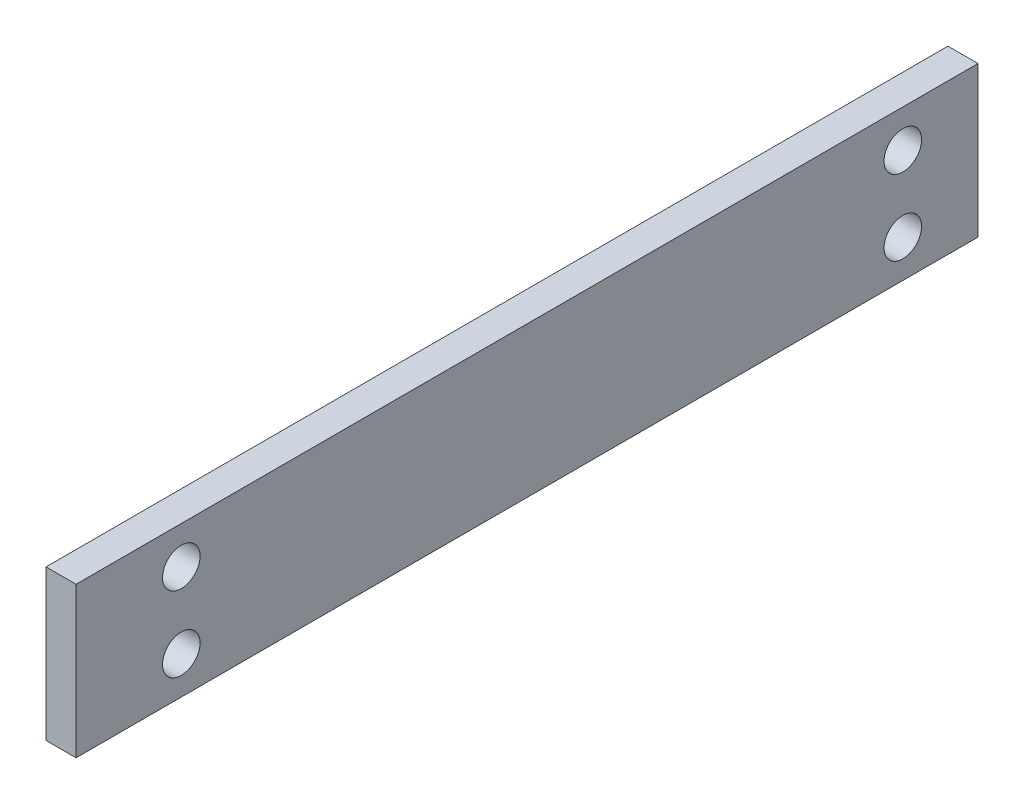
ISO-10303-21;
HEADER;
FILE_DESCRIPTION(('STEP AP214'),'2;1');
FILE_NAME('part.step','',(''),(''),'','','');
FILE_SCHEMA(('AUTOMOTIVE_DESIGN { 1 0 10303 214 1 1 1 1 }'));
ENDSEC;
DATA;
#1=APPLICATION_CONTEXT('core data for automotive mechanical design processes');
#2=APPLICATION_PROTOCOL_DEFINITION('international standard','automotive_design',2000,#1);
#3=PRODUCT_CONTEXT('',#1,'mechanical');
#4=PRODUCT('Part','Part','',(#3));
#5=PRODUCT_RELATED_PRODUCT_CATEGORY('part','',(#4));
#6=PRODUCT_DEFINITION_FORMATION('','',#4);
#7=PRODUCT_DEFINITION_CONTEXT('part definition',#1,'design');
#8=PRODUCT_DEFINITION('design','',#6,#7);
#9=PRODUCT_DEFINITION_SHAPE('','',#8);
#10=(LENGTH_UNIT() NAMED_UNIT(*) SI_UNIT(.MILLI.,.METRE.));
#11=(NAMED_UNIT(*) PLANE_ANGLE_UNIT() SI_UNIT($,.RADIAN.));
#12=(NAMED_UNIT(*) SI_UNIT($,.STERADIAN.) SOLID_ANGLE_UNIT());
#13=UNCERTAINTY_MEASURE_WITH_UNIT(LENGTH_MEASURE(1.E-05),#10,'distance_accuracy_value','');
#14=(GEOMETRIC_REPRESENTATION_CONTEXT(3) GLOBAL_UNCERTAINTY_ASSIGNED_CONTEXT((#13)) GLOBAL_UNIT_ASSIGNED_CONTEXT((#10,
#11,#12)) REPRESENTATION_CONTEXT('',''));
#15=CARTESIAN_POINT('',(0.,0.,0.));
#16=DIRECTION('',(0.,0.,1.));
#17=DIRECTION('',(1.,0.,0.));
#18=AXIS2_PLACEMENT_3D('',#15,#16,#17);
#19=CARTESIAN_POINT('',(4.,0.,0.));
#20=DIRECTION('',(-1.,0.,0.));
#21=DIRECTION('',(0.,0.,1.));
#22=AXIS2_PLACEMENT_3D('',#19,#20,#21);
#23=PLANE('',#22);
#24=DIRECTION('',(0.,-1.,0.));
#25=VECTOR('',#24,1.);
#26=CARTESIAN_POINT('',(4.,0.,0.));
#27=LINE('',#26,#25);
#28=CARTESIAN_POINT('',(4.,20.,0.));
#29=VERTEX_POINT('',#28);
#30=CARTESIAN_POINT('',(4.,0.,0.));
#31=VERTEX_POINT('',#30);
#32=EDGE_CURVE('E87',#29,#31,#27,.T.);
#33=ORIENTED_EDGE('',*,*,#32,.T.);
#34=DIRECTION('',(0.,0.,-1.));
#35=VECTOR('',#34,1.);
#36=CARTESIAN_POINT('',(4.,0.,0.));
#37=LINE('',#36,#35);
#38=CARTESIAN_POINT('',(4.,0.,-120.));
#39=VERTEX_POINT('',#38);
#40=EDGE_CURVE('E82',#31,#39,#37,.T.);
#41=ORIENTED_EDGE('',*,*,#40,.T.);
#42=DIRECTION('',(0.,1.,0.));
#43=VECTOR('',#42,1.);
#44=CARTESIAN_POINT('',(4.,0.,-120.));
#45=LINE('',#44,#43);
#46=CARTESIAN_POINT('',(4.,20.,-120.));
#47=VERTEX_POINT('',#46);
#48=EDGE_CURVE('E85',#39,#47,#45,.T.);
#49=ORIENTED_EDGE('',*,*,#48,.T.);
#50=DIRECTION('',(0.,0.,1.));
#51=VECTOR('',#50,1.);
#52=CARTESIAN_POINT('',(4.,20.,0.));
#53=LINE('',#52,#51);
#54=EDGE_CURVE('E52',#47,#29,#53,.T.);
#55=ORIENTED_EDGE('',*,*,#54,.T.);
#56=EDGE_LOOP('',(#33,#41,#49,#55));
#57=FACE_BOUND('',#56,.T.);
#58=CARTESIAN_POINT('',(4.,15.,-110.));
#59=DIRECTION('',(1.,0.,0.));
#60=DIRECTION('',(0.,0.,-1.));
#61=AXIS2_PLACEMENT_3D('',#58,#59,#60);
#62=CIRCLE('',#61,2.50000000000001);
#63=CARTESIAN_POINT('',(4.,15.,-112.5));
#64=VERTEX_POINT('',#63);
#65=EDGE_CURVE('E102',#64,#64,#62,.T.);
#66=ORIENTED_EDGE('',*,*,#65,.F.);
#67=EDGE_LOOP('',(#66));
#68=FACE_BOUND('',#67,.T.);
#69=CARTESIAN_POINT('',(4.,5.,-110.));
#70=DIRECTION('',(1.,0.,0.));
#71=DIRECTION('',(0.,0.,-1.));
#72=AXIS2_PLACEMENT_3D('',#69,#70,#71);
#73=CIRCLE('',#72,2.50000000000001);
#74=CARTESIAN_POINT('',(4.,5.,-112.5));
#75=VERTEX_POINT('',#74);
#76=EDGE_CURVE('E117',#75,#75,#73,.T.);
#77=ORIENTED_EDGE('',*,*,#76,.F.);
#78=EDGE_LOOP('',(#77));
#79=FACE_BOUND('',#78,.T.);
#80=CARTESIAN_POINT('',(4.,15.,-14.));
#81=DIRECTION('',(1.,0.,0.));
#82=DIRECTION('',(0.,0.,-1.));
#83=AXIS2_PLACEMENT_3D('',#80,#81,#82);
#84=CIRCLE('',#83,2.5);
#85=CARTESIAN_POINT('',(4.,15.,-16.5));
#86=VERTEX_POINT('',#85);
#87=EDGE_CURVE('E123',#86,#86,#84,.T.);
#88=ORIENTED_EDGE('',*,*,#87,.F.);
#89=EDGE_LOOP('',(#88));
#90=FACE_BOUND('',#89,.T.);
#91=CARTESIAN_POINT('',(4.,5.,-14.));
#92=DIRECTION('',(1.,0.,0.));
#93=DIRECTION('',(0.,0.,-1.));
#94=AXIS2_PLACEMENT_3D('',#91,#92,#93);
#95=CIRCLE('',#94,2.50000000000001);
#96=CARTESIAN_POINT('',(4.,5.,-16.5));
#97=VERTEX_POINT('',#96);
#98=EDGE_CURVE('E129',#97,#97,#95,.T.);
#99=ORIENTED_EDGE('',*,*,#98,.F.);
#100=EDGE_LOOP('',(#99));
#101=FACE_BOUND('',#100,.T.);
#102=ADVANCED_FACE('F35',(#57,#68,#79,#90,#101),#23,.F.);
#103=CARTESIAN_POINT('',(0.,0.,0.));
#104=DIRECTION('',(-1.,0.,0.));
#105=DIRECTION('',(0.,0.,1.));
#106=AXIS2_PLACEMENT_3D('',#103,#104,#105);
#107=PLANE('',#106);
#108=CARTESIAN_POINT('',(0.,15.,-14.));
#109=DIRECTION('',(1.,0.,0.));
#110=DIRECTION('',(0.,0.,-1.));
#111=AXIS2_PLACEMENT_3D('',#108,#109,#110);
#112=CIRCLE('',#111,2.5);
#113=CARTESIAN_POINT('',(0.,15.,-16.5));
#114=VERTEX_POINT('',#113);
#115=EDGE_CURVE('E126',#114,#114,#112,.T.);
#116=ORIENTED_EDGE('',*,*,#115,.T.);
#117=EDGE_LOOP('',(#116));
#118=FACE_BOUND('',#117,.T.);
#119=CARTESIAN_POINT('',(0.,15.,-110.));
#120=DIRECTION('',(1.,0.,0.));
#121=DIRECTION('',(0.,0.,-1.));
#122=AXIS2_PLACEMENT_3D('',#119,#120,#121);
#123=CIRCLE('',#122,2.50000000000001);
#124=CARTESIAN_POINT('',(0.,15.,-112.5));
#125=VERTEX_POINT('',#124);
#126=EDGE_CURVE('E114',#125,#125,#123,.T.);
#127=ORIENTED_EDGE('',*,*,#126,.T.);
#128=EDGE_LOOP('',(#127));
#129=FACE_BOUND('',#128,.T.);
#130=DIRECTION('',(0.,-1.,0.));
#131=VECTOR('',#130,1.);
#132=CARTESIAN_POINT('',(0.,0.,0.));
#133=LINE('',#132,#131);
#134=CARTESIAN_POINT('',(0.,20.,0.));
#135=VERTEX_POINT('',#134);
#136=CARTESIAN_POINT('',(0.,0.,0.));
#137=VERTEX_POINT('',#136);
#138=EDGE_CURVE('E99',#135,#137,#133,.T.);
#139=ORIENTED_EDGE('',*,*,#138,.F.);
#140=DIRECTION('',(0.,0.,1.));
#141=VECTOR('',#140,1.);
#142=CARTESIAN_POINT('',(0.,20.,0.));
#143=LINE('',#142,#141);
#144=CARTESIAN_POINT('',(0.,20.,-120.));
#145=VERTEX_POINT('',#144);
#146=EDGE_CURVE('E75',#145,#135,#143,.T.);
#147=ORIENTED_EDGE('',*,*,#146,.F.);
#148=DIRECTION('',(0.,1.,0.));
#149=VECTOR('',#148,1.);
#150=CARTESIAN_POINT('',(0.,0.,-120.));
#151=LINE('',#150,#149);
#152=CARTESIAN_POINT('',(0.,0.,-120.));
#153=VERTEX_POINT('',#152);
#154=EDGE_CURVE('E69',#153,#145,#151,.T.);
#155=ORIENTED_EDGE('',*,*,#154,.F.);
#156=DIRECTION('',(0.,0.,-1.));
#157=VECTOR('',#156,1.);
#158=CARTESIAN_POINT('',(0.,0.,0.));
#159=LINE('',#158,#157);
#160=EDGE_CURVE('E91',#137,#153,#159,.T.);
#161=ORIENTED_EDGE('',*,*,#160,.F.);
#162=EDGE_LOOP('',(#139,#147,#155,#161));
#163=FACE_BOUND('',#162,.T.);
#164=CARTESIAN_POINT('',(0.,5.,-110.));
#165=DIRECTION('',(1.,0.,0.));
#166=DIRECTION('',(0.,0.,-1.));
#167=AXIS2_PLACEMENT_3D('',#164,#165,#166);
#168=CIRCLE('',#167,2.50000000000001);
#169=CARTESIAN_POINT('',(0.,5.,-112.5));
#170=VERTEX_POINT('',#169);
#171=EDGE_CURVE('E120',#170,#170,#168,.T.);
#172=ORIENTED_EDGE('',*,*,#171,.T.);
#173=EDGE_LOOP('',(#172));
#174=FACE_BOUND('',#173,.T.);
#175=CARTESIAN_POINT('',(0.,5.,-14.));
#176=DIRECTION('',(1.,0.,0.));
#177=DIRECTION('',(0.,0.,-1.));
#178=AXIS2_PLACEMENT_3D('',#175,#176,#177);
#179=CIRCLE('',#178,2.50000000000001);
#180=CARTESIAN_POINT('',(0.,5.,-16.5));
#181=VERTEX_POINT('',#180);
#182=EDGE_CURVE('E132',#181,#181,#179,.T.);
#183=ORIENTED_EDGE('',*,*,#182,.T.);
#184=EDGE_LOOP('',(#183));
#185=FACE_BOUND('',#184,.T.);
#186=ADVANCED_FACE('F110',(#118,#129,#163,#174,#185),#107,.T.);
#187=CARTESIAN_POINT('',(4.,0.,0.));
#188=DIRECTION('',(0.,0.,-1.));
#189=DIRECTION('',(-1.,0.,0.));
#190=AXIS2_PLACEMENT_3D('',#187,#188,#189);
#191=PLANE('',#190);
#192=ORIENTED_EDGE('',*,*,#138,.T.);
#193=DIRECTION('',(-1.,0.,0.));
#194=VECTOR('',#193,1.);
#195=CARTESIAN_POINT('',(4.,0.,0.));
#196=LINE('',#195,#194);
#197=EDGE_CURVE('E11',#31,#137,#196,.T.);
#198=ORIENTED_EDGE('',*,*,#197,.F.);
#199=ORIENTED_EDGE('',*,*,#32,.F.);
#200=DIRECTION('',(-1.,0.,0.));
#201=VECTOR('',#200,1.);
#202=CARTESIAN_POINT('',(4.,20.,0.));
#203=LINE('',#202,#201);
#204=EDGE_CURVE('E95',#29,#135,#203,.T.);
#205=ORIENTED_EDGE('',*,*,#204,.T.);
#206=EDGE_LOOP('',(#192,#198,#199,#205));
#207=FACE_BOUND('',#206,.T.);
#208=ADVANCED_FACE('F37',(#207),#191,.F.);
#209=CARTESIAN_POINT('',(4.,0.,0.));
#210=DIRECTION('',(0.,1.,0.));
#211=DIRECTION('',(0.,0.,1.));
#212=AXIS2_PLACEMENT_3D('',#209,#210,#211);
#213=PLANE('',#212);
#214=ORIENTED_EDGE('',*,*,#160,.T.);
#215=DIRECTION('',(-1.,0.,0.));
#216=VECTOR('',#215,1.);
#217=CARTESIAN_POINT('',(4.,0.,-120.));
#218=LINE('',#217,#216);
#219=EDGE_CURVE('E44',#39,#153,#218,.T.);
#220=ORIENTED_EDGE('',*,*,#219,.F.);
#221=ORIENTED_EDGE('',*,*,#40,.F.);
#222=ORIENTED_EDGE('',*,*,#197,.T.);
#223=EDGE_LOOP('',(#214,#220,#221,#222));
#224=FACE_BOUND('',#223,.T.);
#225=ADVANCED_FACE('F90',(#224),#213,.F.);
#226=CARTESIAN_POINT('',(4.,0.,-120.));
#227=DIRECTION('',(0.,0.,1.));
#228=DIRECTION('',(1.,0.,0.));
#229=AXIS2_PLACEMENT_3D('',#226,#227,#228);
#230=PLANE('',#229);
#231=ORIENTED_EDGE('',*,*,#154,.T.);
#232=DIRECTION('',(-1.,0.,0.));
#233=VECTOR('',#232,1.);
#234=CARTESIAN_POINT('',(4.,20.,-120.));
#235=LINE('',#234,#233);
#236=EDGE_CURVE('E92',#47,#145,#235,.T.);
#237=ORIENTED_EDGE('',*,*,#236,.F.);
#238=ORIENTED_EDGE('',*,*,#48,.F.);
#239=ORIENTED_EDGE('',*,*,#219,.T.);
#240=EDGE_LOOP('',(#231,#237,#238,#239));
#241=FACE_BOUND('',#240,.T.);
#242=ADVANCED_FACE('F93',(#241),#230,.F.);
#243=CARTESIAN_POINT('',(4.,20.,0.));
#244=DIRECTION('',(0.,-1.,0.));
#245=DIRECTION('',(0.,0.,-1.));
#246=AXIS2_PLACEMENT_3D('',#243,#244,#245);
#247=PLANE('',#246);
#248=ORIENTED_EDGE('',*,*,#146,.T.);
#249=ORIENTED_EDGE('',*,*,#204,.F.);
#250=ORIENTED_EDGE('',*,*,#54,.F.);
#251=ORIENTED_EDGE('',*,*,#236,.T.);
#252=EDGE_LOOP('',(#248,#249,#250,#251));
#253=FACE_BOUND('',#252,.T.);
#254=ADVANCED_FACE('F107',(#253),#247,.F.);
#255=CARTESIAN_POINT('',(4.,15.,-110.));
#256=DIRECTION('',(-1.,0.,0.));
#257=DIRECTION('',(0.,0.,1.));
#258=AXIS2_PLACEMENT_3D('',#255,#256,#257);
#259=CYLINDRICAL_SURFACE('',#258,2.50000000000001);
#260=ORIENTED_EDGE('',*,*,#65,.T.);
#261=EDGE_LOOP('',(#260));
#262=FACE_BOUND('',#261,.T.);
#263=ORIENTED_EDGE('',*,*,#126,.F.);
#264=EDGE_LOOP('',(#263));
#265=FACE_BOUND('',#264,.T.);
#266=ADVANCED_FACE('F149',(#262,#265),#259,.F.);
#267=CARTESIAN_POINT('',(4.,5.,-110.));
#268=DIRECTION('',(-1.,0.,0.));
#269=DIRECTION('',(0.,0.,1.));
#270=AXIS2_PLACEMENT_3D('',#267,#268,#269);
#271=CYLINDRICAL_SURFACE('',#270,2.50000000000001);
#272=ORIENTED_EDGE('',*,*,#76,.T.);
#273=EDGE_LOOP('',(#272));
#274=FACE_BOUND('',#273,.T.);
#275=ORIENTED_EDGE('',*,*,#171,.F.);
#276=EDGE_LOOP('',(#275));
#277=FACE_BOUND('',#276,.T.);
#278=ADVANCED_FACE('F195',(#274,#277),#271,.F.);
#279=CARTESIAN_POINT('',(4.,15.,-14.));
#280=DIRECTION('',(-1.,0.,0.));
#281=DIRECTION('',(0.,0.,1.));
#282=AXIS2_PLACEMENT_3D('',#279,#280,#281);
#283=CYLINDRICAL_SURFACE('',#282,2.5);
#284=ORIENTED_EDGE('',*,*,#87,.T.);
#285=EDGE_LOOP('',(#284));
#286=FACE_BOUND('',#285,.T.);
#287=ORIENTED_EDGE('',*,*,#115,.F.);
#288=EDGE_LOOP('',(#287));
#289=FACE_BOUND('',#288,.T.);
#290=ADVANCED_FACE('F203',(#286,#289),#283,.F.);
#291=CARTESIAN_POINT('',(4.,5.,-14.));
#292=DIRECTION('',(-1.,0.,0.));
#293=DIRECTION('',(0.,0.,1.));
#294=AXIS2_PLACEMENT_3D('',#291,#292,#293);
#295=CYLINDRICAL_SURFACE('',#294,2.50000000000001);
#296=ORIENTED_EDGE('',*,*,#98,.T.);
#297=EDGE_LOOP('',(#296));
#298=FACE_BOUND('',#297,.T.);
#299=ORIENTED_EDGE('',*,*,#182,.F.);
#300=EDGE_LOOP('',(#299));
#301=FACE_BOUND('',#300,.T.);
#302=ADVANCED_FACE('F138',(#298,#301),#295,.F.);
#303=CLOSED_SHELL('',(#102,#186,#208,#225,#242,#254,#266,#278,#290,#302));
#304=MANIFOLD_SOLID_BREP('B2',#303);
#305=ADVANCED_BREP_SHAPE_REPRESENTATION('',(#18,#304),#14);
#306=SHAPE_DEFINITION_REPRESENTATION(#9,#305);
ENDSEC;
END-ISO-10303-21;
